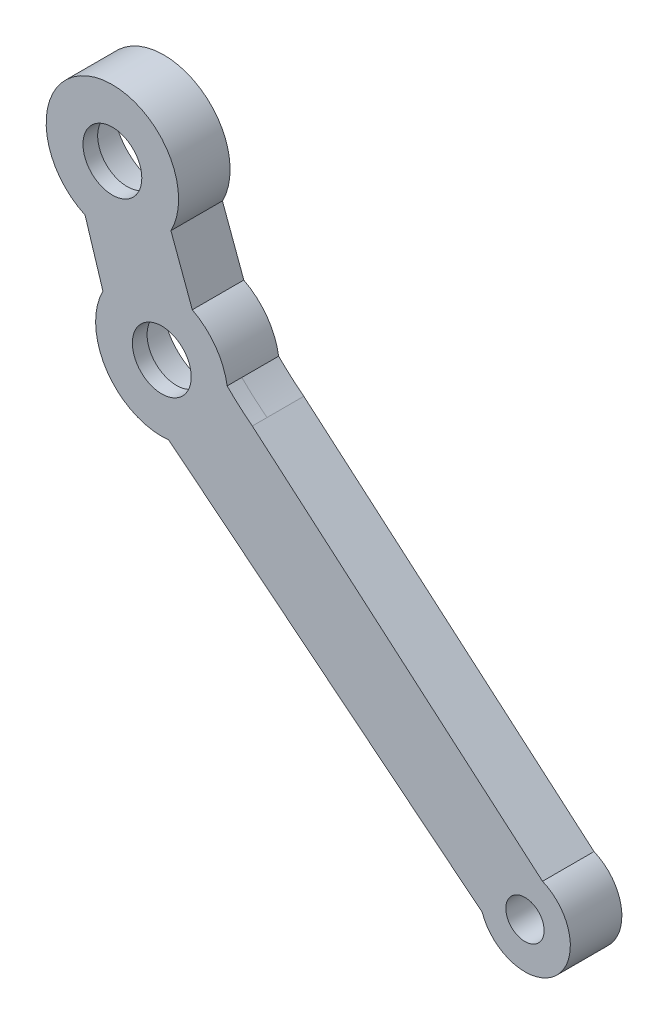
ISO-10303-21;
HEADER;
FILE_DESCRIPTION(('STEP AP214'),'2;1');
FILE_NAME('part.step','',(''),(''),'','','');
FILE_SCHEMA(('AUTOMOTIVE_DESIGN { 1 0 10303 214 1 1 1 1 }'));
ENDSEC;
DATA;
#1=APPLICATION_CONTEXT('core data for automotive mechanical design processes');
#2=APPLICATION_PROTOCOL_DEFINITION('international standard','automotive_design',2000,#1);
#3=PRODUCT_CONTEXT('',#1,'mechanical');
#4=PRODUCT('Part','Part','',(#3));
#5=PRODUCT_RELATED_PRODUCT_CATEGORY('part','',(#4));
#6=PRODUCT_DEFINITION_FORMATION('','',#4);
#7=PRODUCT_DEFINITION_CONTEXT('part definition',#1,'design');
#8=PRODUCT_DEFINITION('design','',#6,#7);
#9=PRODUCT_DEFINITION_SHAPE('','',#8);
#10=(LENGTH_UNIT() NAMED_UNIT(*) SI_UNIT(.MILLI.,.METRE.));
#11=(NAMED_UNIT(*) PLANE_ANGLE_UNIT() SI_UNIT($,.RADIAN.));
#12=(NAMED_UNIT(*) SI_UNIT($,.STERADIAN.) SOLID_ANGLE_UNIT());
#13=UNCERTAINTY_MEASURE_WITH_UNIT(LENGTH_MEASURE(1.E-05),#10,'distance_accuracy_value','');
#14=(GEOMETRIC_REPRESENTATION_CONTEXT(3) GLOBAL_UNCERTAINTY_ASSIGNED_CONTEXT((#13)) GLOBAL_UNIT_ASSIGNED_CONTEXT((#10,
#11,#12)) REPRESENTATION_CONTEXT('',''));
#15=CARTESIAN_POINT('',(0.,0.,0.));
#16=DIRECTION('',(0.,0.,1.));
#17=DIRECTION('',(1.,0.,0.));
#18=AXIS2_PLACEMENT_3D('',#15,#16,#17);
#19=CARTESIAN_POINT('',(-57.5428106413349,-67.0233845086147,5.));
#20=DIRECTION('',(-0.651405865815987,-0.758729462971173,0.));
#21=DIRECTION('',(0.758729462971173,-0.651405865815987,0.));
#22=AXIS2_PLACEMENT_3D('',#19,#20,#21);
#23=PLANE('',#22);
#24=DIRECTION('',(-0.758729462971173,0.651405865815987,0.));
#25=VECTOR('',#24,1.);
#26=CARTESIAN_POINT('',(-57.5428106413349,-67.0233845086147,0.));
#27=LINE('',#26,#25);
#28=CARTESIAN_POINT('',(-119.047770684669,-14.2184076304096,0.));
#29=VERTEX_POINT('',#28);
#30=CARTESIAN_POINT('',(-158.491736923605,19.6461412411646,0.));
#31=VERTEX_POINT('',#30);
#32=EDGE_CURVE('E115',#29,#31,#27,.T.);
#33=ORIENTED_EDGE('',*,*,#32,.T.);
#34=DIRECTION('',(0.,0.,-1.));
#35=VECTOR('',#34,1.);
#36=CARTESIAN_POINT('',(-158.491736923605,19.6461412411646,5.));
#37=LINE('',#36,#35);
#38=CARTESIAN_POINT('',(-158.491736923605,19.6461412411646,5.));
#39=VERTEX_POINT('',#38);
#40=EDGE_CURVE('E11',#39,#31,#37,.T.);
#41=ORIENTED_EDGE('',*,*,#40,.F.);
#42=DIRECTION('',(0.,0.,-1.));
#43=VECTOR('',#42,1.);
#44=CARTESIAN_POINT('',(-158.491736923605,19.6461412411646,7.));
#45=LINE('',#44,#43);
#46=CARTESIAN_POINT('',(-158.491736923605,19.6461412411646,7.));
#47=VERTEX_POINT('',#46);
#48=EDGE_CURVE('E228',#47,#39,#45,.T.);
#49=ORIENTED_EDGE('',*,*,#48,.F.);
#50=DIRECTION('',(-0.758729462971173,0.651405865815987,0.));
#51=VECTOR('',#50,1.);
#52=CARTESIAN_POINT('',(-119.047770684669,-14.2184076304096,7.));
#53=LINE('',#52,#51);
#54=CARTESIAN_POINT('',(-119.047770684669,-14.2184076304096,7.));
#55=VERTEX_POINT('',#54);
#56=EDGE_CURVE('E118',#55,#47,#53,.T.);
#57=ORIENTED_EDGE('',*,*,#56,.F.);
#58=DIRECTION('',(0.,0.,-1.));
#59=VECTOR('',#58,1.);
#60=CARTESIAN_POINT('',(-119.047770684669,-14.2184076304096,5.));
#61=LINE('',#60,#59);
#62=EDGE_CURVE('E104',#55,#29,#61,.T.);
#63=ORIENTED_EDGE('',*,*,#62,.T.);
#64=EDGE_LOOP('',(#33,#41,#49,#57,#63));
#65=FACE_BOUND('',#64,.T.);
#66=ADVANCED_FACE('F45',(#65),#23,.F.);
#67=CARTESIAN_POINT('',(750386.007974105,660889.732028088,5.));
#68=CARTESIAN_POINT('',(-745228.713855073,-666967.260908976,5.));
#69=CARTESIAN_POINT('',(739418.932730248,673140.55390769,5.));
#70=B_SPLINE_CURVE_WITH_KNOTS('',2,(#67,#68,#69),.UNSPECIFIED.,.F.,.F.,(3,3),(0.,1.),.UNSPECIFIED.);
#71=DIRECTION('',(0.,0.,-1.));
#72=VECTOR('',#71,1.);
#73=SURFACE_OF_LINEAR_EXTRUSION('',#70,#72);
#74=CARTESIAN_POINT('',(750386.007974105,660889.732028088,0.));
#75=CARTESIAN_POINT('',(-745228.713855073,-666967.260908976,0.));
#76=CARTESIAN_POINT('',(739418.932730248,673140.55390769,0.));
#77=B_SPLINE_CURVE_WITH_KNOTS('',2,(#74,#75,#76),.UNSPECIFIED.,.F.,.F.,(3,3),(0.,1.),.UNSPECIFIED.);
#78=CARTESIAN_POINT('',(-161.909962093722,22.6565194071281,0.));
#79=VERTEX_POINT('',#78);
#80=EDGE_CURVE('E124',#31,#79,#77,.T.);
#81=ORIENTED_EDGE('',*,*,#80,.T.);
#82=DIRECTION('',(0.,0.,-1.));
#83=VECTOR('',#82,1.);
#84=CARTESIAN_POINT('',(-161.909962093722,22.6565194071281,5.));
#85=LINE('',#84,#83);
#86=CARTESIAN_POINT('',(-161.909962093722,22.6565194071281,5.));
#87=VERTEX_POINT('',#86);
#88=EDGE_CURVE('E55',#87,#79,#85,.T.);
#89=ORIENTED_EDGE('',*,*,#88,.F.);
#90=EDGE_CURVE('E110',#39,#87,#70,.T.);
#91=ORIENTED_EDGE('',*,*,#90,.F.);
#92=ORIENTED_EDGE('',*,*,#40,.T.);
#93=EDGE_LOOP('',(#81,#89,#91,#92));
#94=FACE_BOUND('',#93,.T.);
#95=ADVANCED_FACE('F250',(#94),#73,.F.);
#96=CARTESIAN_POINT('',(-170.794274728342,21.2709257140738,5.));
#97=DIRECTION('',(0.,0.,-1.));
#98=DIRECTION('',(-1.,0.,0.));
#99=AXIS2_PLACEMENT_3D('',#96,#97,#98);
#100=CYLINDRICAL_SURFACE('',#99,8.99171178763538);
#101=CARTESIAN_POINT('',(-170.794274728342,21.2709257140738,0.));
#102=DIRECTION('',(0.,0.,1.));
#103=DIRECTION('',(1.,0.,0.));
#104=AXIS2_PLACEMENT_3D('',#101,#102,#103);
#105=CIRCLE('',#104,8.99171178763538);
#106=CARTESIAN_POINT('',(-166.645452489756,29.2482783391312,0.));
#107=VERTEX_POINT('',#106);
#108=EDGE_CURVE('E130',#79,#107,#105,.T.);
#109=ORIENTED_EDGE('',*,*,#108,.T.);
#110=DIRECTION('',(0.,0.,-1.));
#111=VECTOR('',#110,1.);
#112=CARTESIAN_POINT('',(-166.645452489756,29.2482783391312,5.));
#113=LINE('',#112,#111);
#114=CARTESIAN_POINT('',(-166.64545248291,29.2482783522951,7.));
#115=VERTEX_POINT('',#114);
#116=EDGE_CURVE('E175',#115,#107,#113,.T.);
#117=ORIENTED_EDGE('',*,*,#116,.F.);
#118=CARTESIAN_POINT('',(-170.794274728342,21.2709257140738,7.));
#119=DIRECTION('',(0.,0.,1.));
#120=DIRECTION('',(1.,0.,0.));
#121=AXIS2_PLACEMENT_3D('',#118,#119,#120);
#122=CIRCLE('',#121,8.99171180247304);
#123=CARTESIAN_POINT('',(-161.909962022454,22.6565193353554,7.));
#124=VERTEX_POINT('',#123);
#125=EDGE_CURVE('E215',#124,#115,#122,.T.);
#126=ORIENTED_EDGE('',*,*,#125,.F.);
#127=DIRECTION('',(0.,0.,-1.));
#128=VECTOR('',#127,1.);
#129=CARTESIAN_POINT('',(-161.909962022454,22.6565193353554,7.));
#130=LINE('',#129,#128);
#131=EDGE_CURVE('E185',#124,#87,#130,.T.);
#132=ORIENTED_EDGE('',*,*,#131,.T.);
#133=ORIENTED_EDGE('',*,*,#88,.T.);
#134=EDGE_LOOP('',(#109,#117,#126,#132,#133));
#135=FACE_BOUND('',#134,.T.);
#136=ADVANCED_FACE('F181',(#135),#100,.T.);
#137=CARTESIAN_POINT('',(-137.117582379586,-50.6648768191572,5.));
#138=DIRECTION('',(-0.938014544046687,-0.346595896047381,0.));
#139=DIRECTION('',(0.346595896047381,-0.938014544046687,0.));
#140=AXIS2_PLACEMENT_3D('',#137,#138,#139);
#141=PLANE('',#140);
#142=DIRECTION('',(-0.346595896047381,0.938014544046687,0.));
#143=VECTOR('',#142,1.);
#144=CARTESIAN_POINT('',(-137.117582379586,-50.6648768191572,0.));
#145=LINE('',#144,#143);
#146=CARTESIAN_POINT('',(-169.551288031007,37.112526102551,0.));
#147=VERTEX_POINT('',#146);
#148=EDGE_CURVE('E144',#107,#147,#145,.T.);
#149=ORIENTED_EDGE('',*,*,#148,.T.);
#150=DIRECTION('',(0.,0.,-1.));
#151=VECTOR('',#150,1.);
#152=CARTESIAN_POINT('',(-169.551288031007,37.112526102551,5.));
#153=LINE('',#152,#151);
#154=CARTESIAN_POINT('',(-169.551288031007,37.112526102551,7.));
#155=VERTEX_POINT('',#154);
#156=EDGE_CURVE('E171',#155,#147,#153,.T.);
#157=ORIENTED_EDGE('',*,*,#156,.F.);
#158=DIRECTION('',(-0.346595896047381,0.938014544046686,0.));
#159=VECTOR('',#158,1.);
#160=CARTESIAN_POINT('',(-166.645452489756,29.2482783391312,7.));
#161=LINE('',#160,#159);
#162=EDGE_CURVE('E209',#115,#155,#161,.T.);
#163=ORIENTED_EDGE('',*,*,#162,.F.);
#164=ORIENTED_EDGE('',*,*,#116,.T.);
#165=EDGE_LOOP('',(#149,#157,#163,#164));
#166=FACE_BOUND('',#165,.T.);
#167=ADVANCED_FACE('F191',(#166),#141,.F.);
#168=CARTESIAN_POINT('',(-177.50849540305,41.3176242985861,5.));
#169=DIRECTION('',(0.,0.,-1.));
#170=DIRECTION('',(-1.,0.,0.));
#171=AXIS2_PLACEMENT_3D('',#168,#169,#170);
#172=CYLINDRICAL_SURFACE('',#171,9.);
#173=CARTESIAN_POINT('',(-177.50849540305,41.3176242985861,0.));
#174=DIRECTION('',(0.,0.,1.));
#175=DIRECTION('',(1.,0.,0.));
#176=AXIS2_PLACEMENT_3D('',#173,#174,#175);
#177=CIRCLE('',#176,9.);
#178=CARTESIAN_POINT('',(-181.222431589448,33.1196563794388,0.));
#179=VERTEX_POINT('',#178);
#180=EDGE_CURVE('E147',#147,#179,#177,.T.);
#181=ORIENTED_EDGE('',*,*,#180,.T.);
#182=DIRECTION('',(0.,0.,-1.));
#183=VECTOR('',#182,1.);
#184=CARTESIAN_POINT('',(-181.222431589448,33.1196563794388,5.));
#185=LINE('',#184,#183);
#186=CARTESIAN_POINT('',(-181.222431589448,33.1196563794388,7.));
#187=VERTEX_POINT('',#186);
#188=EDGE_CURVE('E167',#187,#179,#185,.T.);
#189=ORIENTED_EDGE('',*,*,#188,.F.);
#190=CARTESIAN_POINT('',(-177.50849540305,41.3176242985861,7.));
#191=DIRECTION('',(0.,0.,1.));
#192=DIRECTION('',(1.,0.,0.));
#193=AXIS2_PLACEMENT_3D('',#190,#191,#192);
#194=CIRCLE('',#193,9.00000000000001);
#195=EDGE_CURVE('E200',#155,#187,#194,.T.);
#196=ORIENTED_EDGE('',*,*,#195,.F.);
#197=ORIENTED_EDGE('',*,*,#156,.T.);
#198=EDGE_LOOP('',(#181,#189,#196,#197));
#199=FACE_BOUND('',#198,.T.);
#200=ADVANCED_FACE('F197',(#199),#172,.T.);
#201=CARTESIAN_POINT('',(-155.544938051549,-48.7718796659953,5.));
#202=DIRECTION('',(0.954192963420192,0.2991918925362,0.));
#203=DIRECTION('',(-0.2991918925362,0.954192963420192,0.));
#204=AXIS2_PLACEMENT_3D('',#201,#202,#203);
#205=PLANE('',#204);
#206=DIRECTION('',(0.2991918925362,-0.954192963420192,0.));
#207=VECTOR('',#206,1.);
#208=CARTESIAN_POINT('',(-155.544938051549,-48.7718796659953,0.));
#209=LINE('',#208,#207);
#210=CARTESIAN_POINT('',(-178.794316038629,25.3758276502487,0.));
#211=VERTEX_POINT('',#210);
#212=EDGE_CURVE('E150',#179,#211,#209,.T.);
#213=ORIENTED_EDGE('',*,*,#212,.T.);
#214=DIRECTION('',(0.,0.,-1.));
#215=VECTOR('',#214,1.);
#216=CARTESIAN_POINT('',(-178.794316038629,25.3758276502487,5.));
#217=LINE('',#216,#215);
#218=CARTESIAN_POINT('',(-178.794316038629,25.3758276502487,7.));
#219=VERTEX_POINT('',#218);
#220=EDGE_CURVE('E163',#219,#211,#217,.T.);
#221=ORIENTED_EDGE('',*,*,#220,.F.);
#222=DIRECTION('',(0.2991918925362,-0.954192963420192,0.));
#223=VECTOR('',#222,1.);
#224=CARTESIAN_POINT('',(-181.222431589448,33.1196563794388,7.));
#225=LINE('',#224,#223);
#226=EDGE_CURVE('E208',#187,#219,#225,.T.);
#227=ORIENTED_EDGE('',*,*,#226,.F.);
#228=ORIENTED_EDGE('',*,*,#188,.T.);
#229=EDGE_LOOP('',(#213,#221,#227,#228));
#230=FACE_BOUND('',#229,.T.);
#231=ADVANCED_FACE('F339',(#230),#205,.F.);
#232=CARTESIAN_POINT('',(-170.794274728342,21.2709257140738,5.));
#233=DIRECTION('',(0.,0.,-1.));
#234=DIRECTION('',(-1.,0.,0.));
#235=AXIS2_PLACEMENT_3D('',#232,#233,#234);
#236=CYLINDRICAL_SURFACE('',#235,8.99171178763538);
#237=CARTESIAN_POINT('',(-170.794274728342,21.2709257140738,0.));
#238=DIRECTION('',(0.,0.,1.));
#239=DIRECTION('',(1.,0.,0.));
#240=AXIS2_PLACEMENT_3D('',#237,#238,#239);
#241=CIRCLE('',#240,8.99171178763538);
#242=CARTESIAN_POINT('',(-169.857983807643,12.3280939375212,0.));
#243=VERTEX_POINT('',#242);
#244=EDGE_CURVE('E153',#211,#243,#241,.T.);
#245=ORIENTED_EDGE('',*,*,#244,.T.);
#246=DIRECTION('',(0.,0.,-1.));
#247=VECTOR('',#246,1.);
#248=CARTESIAN_POINT('',(-169.857983807643,12.3280939375212,5.));
#249=LINE('',#248,#247);
#250=CARTESIAN_POINT('',(-169.857983807643,12.3280939375212,7.));
#251=VERTEX_POINT('',#250);
#252=EDGE_CURVE('E160',#251,#243,#249,.T.);
#253=ORIENTED_EDGE('',*,*,#252,.F.);
#254=CARTESIAN_POINT('',(-170.794274728342,21.2709257140738,7.));
#255=DIRECTION('',(0.,0.,1.));
#256=DIRECTION('',(1.,0.,0.));
#257=AXIS2_PLACEMENT_3D('',#254,#255,#256);
#258=CIRCLE('',#257,8.99171178763539);
#259=EDGE_CURVE('E213',#219,#251,#258,.T.);
#260=ORIENTED_EDGE('',*,*,#259,.F.);
#261=ORIENTED_EDGE('',*,*,#220,.T.);
#262=EDGE_LOOP('',(#245,#253,#260,#261));
#263=FACE_BOUND('',#262,.T.);
#264=ADVANCED_FACE('F336',(#263),#236,.T.);
#265=CARTESIAN_POINT('',(-60.6968096456186,-75.4676287695073,5.));
#266=DIRECTION('',(0.626724705023871,0.77924074849352,0.));
#267=DIRECTION('',(-0.77924074849352,0.626724705023871,0.));
#268=AXIS2_PLACEMENT_3D('',#265,#266,#267);
#269=PLANE('',#268);
#270=DIRECTION('',(0.77924074849352,-0.626724705023871,0.));
#271=VECTOR('',#270,1.);
#272=CARTESIAN_POINT('',(-60.6968096456186,-75.4676287695073,0.));
#273=LINE('',#272,#271);
#274=CARTESIAN_POINT('',(-127.253789063666,-21.9374413740227,0.));
#275=VERTEX_POINT('',#274);
#276=EDGE_CURVE('E93',#243,#275,#273,.T.);
#277=ORIENTED_EDGE('',*,*,#276,.T.);
#278=DIRECTION('',(0.,0.,-1.));
#279=VECTOR('',#278,1.);
#280=CARTESIAN_POINT('',(-127.253789063666,-21.9374413740227,5.));
#281=LINE('',#280,#279);
#282=CARTESIAN_POINT('',(-127.253789063666,-21.9374413740227,7.));
#283=VERTEX_POINT('',#282);
#284=EDGE_CURVE('E106',#283,#275,#281,.T.);
#285=ORIENTED_EDGE('',*,*,#284,.F.);
#286=DIRECTION('',(0.77924074849352,-0.626724705023871,0.));
#287=VECTOR('',#286,1.);
#288=CARTESIAN_POINT('',(-169.857983807643,12.3280939375212,7.));
#289=LINE('',#288,#287);
#290=EDGE_CURVE('E222',#251,#283,#289,.T.);
#291=ORIENTED_EDGE('',*,*,#290,.F.);
#292=ORIENTED_EDGE('',*,*,#252,.T.);
#293=EDGE_LOOP('',(#277,#285,#291,#292));
#294=FACE_BOUND('',#293,.T.);
#295=ADVANCED_FACE('F260',(#294),#269,.F.);
#296=CARTESIAN_POINT('',(-121.432089480919,-19.9050450231592,5.));
#297=DIRECTION('',(0.,0.,-1.));
#298=DIRECTION('',(-1.,0.,0.));
#299=AXIS2_PLACEMENT_3D('',#296,#297,#298);
#300=CYLINDRICAL_SURFACE('',#299,2.6);
#301=CARTESIAN_POINT('',(-121.432089480919,-19.9050450231592,0.));
#302=DIRECTION('',(0.,0.,1.));
#303=DIRECTION('',(1.,0.,0.));
#304=AXIS2_PLACEMENT_3D('',#301,#302,#303);
#305=CIRCLE('',#304,2.6);
#306=CARTESIAN_POINT('',(-118.832089480919,-19.9050450231592,0.));
#307=VERTEX_POINT('',#306);
#308=EDGE_CURVE('E126',#307,#307,#305,.T.);
#309=ORIENTED_EDGE('',*,*,#308,.F.);
#310=EDGE_LOOP('',(#309));
#311=FACE_BOUND('',#310,.T.);
#312=CARTESIAN_POINT('',(-121.432089480919,-19.9050450231592,7.));
#313=DIRECTION('',(0.,0.,1.));
#314=DIRECTION('',(1.,0.,0.));
#315=AXIS2_PLACEMENT_3D('',#312,#313,#314);
#316=CIRCLE('',#315,2.59999999998777);
#317=CARTESIAN_POINT('',(-118.832089480931,-19.9050450231592,7.));
#318=VERTEX_POINT('',#317);
#319=EDGE_CURVE('E288',#318,#318,#316,.T.);
#320=ORIENTED_EDGE('',*,*,#319,.T.);
#321=EDGE_LOOP('',(#320));
#322=FACE_BOUND('',#321,.T.);
#323=ADVANCED_FACE('F257',(#311,#322),#300,.F.);
#324=CARTESIAN_POINT('',(-177.50849540305,41.3176242985861,5.));
#325=DIRECTION('',(0.,0.,-1.));
#326=DIRECTION('',(-1.,0.,0.));
#327=AXIS2_PLACEMENT_3D('',#324,#325,#326);
#328=CYLINDRICAL_SURFACE('',#327,6.89999999999999);
#329=CARTESIAN_POINT('',(-177.50849540305,41.3176242985861,5.));
#330=DIRECTION('',(0.,0.,1.));
#331=DIRECTION('',(1.,0.,0.));
#332=AXIS2_PLACEMENT_3D('',#329,#330,#331);
#333=CIRCLE('',#332,6.89999999999999);
#334=CARTESIAN_POINT('',(-170.60849540305,41.3176242985861,5.));
#335=VERTEX_POINT('',#334);
#336=EDGE_CURVE('E232',#335,#335,#333,.T.);
#337=ORIENTED_EDGE('',*,*,#336,.T.);
#338=EDGE_LOOP('',(#337));
#339=FACE_BOUND('',#338,.T.);
#340=CARTESIAN_POINT('',(-177.50849540305,41.3176242985861,0.));
#341=DIRECTION('',(0.,0.,1.));
#342=DIRECTION('',(1.,0.,0.));
#343=AXIS2_PLACEMENT_3D('',#340,#341,#342);
#344=CIRCLE('',#343,6.89999999999999);
#345=CARTESIAN_POINT('',(-170.60849540305,41.3176242985861,0.));
#346=VERTEX_POINT('',#345);
#347=EDGE_CURVE('E133',#346,#346,#344,.T.);
#348=ORIENTED_EDGE('',*,*,#347,.F.);
#349=EDGE_LOOP('',(#348));
#350=FACE_BOUND('',#349,.T.);
#351=ADVANCED_FACE('F259',(#339,#350),#328,.F.);
#352=CARTESIAN_POINT('',(-170.794274728342,21.2709257140738,5.));
#353=DIRECTION('',(0.,0.,-1.));
#354=DIRECTION('',(-1.,0.,0.));
#355=AXIS2_PLACEMENT_3D('',#352,#353,#354);
#356=CYLINDRICAL_SURFACE('',#355,6.90151996859568);
#357=CARTESIAN_POINT('',(-170.794274728342,21.2709257140738,5.));
#358=DIRECTION('',(0.,0.,1.));
#359=DIRECTION('',(1.,0.,0.));
#360=AXIS2_PLACEMENT_3D('',#357,#358,#359);
#361=CIRCLE('',#360,6.90151996859568);
#362=CARTESIAN_POINT('',(-163.892754759747,21.2709257140738,5.));
#363=VERTEX_POINT('',#362);
#364=EDGE_CURVE('E233',#363,#363,#361,.T.);
#365=ORIENTED_EDGE('',*,*,#364,.T.);
#366=EDGE_LOOP('',(#365));
#367=FACE_BOUND('',#366,.T.);
#368=CARTESIAN_POINT('',(-170.794274728342,21.2709257140738,0.));
#369=DIRECTION('',(0.,0.,1.));
#370=DIRECTION('',(1.,0.,0.));
#371=AXIS2_PLACEMENT_3D('',#368,#369,#370);
#372=CIRCLE('',#371,6.90151996859568);
#373=CARTESIAN_POINT('',(-163.892754759747,21.2709257140738,0.));
#374=VERTEX_POINT('',#373);
#375=EDGE_CURVE('E237',#374,#374,#372,.T.);
#376=ORIENTED_EDGE('',*,*,#375,.F.);
#377=EDGE_LOOP('',(#376));
#378=FACE_BOUND('',#377,.T.);
#379=ADVANCED_FACE('F47',(#367,#378),#356,.F.);
#380=CARTESIAN_POINT('',(-121.432089480919,-19.9050450231592,5.));
#381=DIRECTION('',(0.,0.,-1.));
#382=DIRECTION('',(-1.,0.,0.));
#383=AXIS2_PLACEMENT_3D('',#380,#381,#382);
#384=CYLINDRICAL_SURFACE('',#383,6.16626474932495);
#385=CARTESIAN_POINT('',(-121.432089480919,-19.9050450231592,0.));
#386=DIRECTION('',(0.,0.,1.));
#387=DIRECTION('',(1.,0.,0.));
#388=AXIS2_PLACEMENT_3D('',#385,#386,#387);
#389=CIRCLE('',#388,6.16626474932495);
#390=EDGE_CURVE('E99',#275,#29,#389,.T.);
#391=ORIENTED_EDGE('',*,*,#390,.T.);
#392=ORIENTED_EDGE('',*,*,#62,.F.);
#393=CARTESIAN_POINT('',(-121.432089480919,-19.9050450231592,7.));
#394=DIRECTION('',(0.,0.,1.));
#395=DIRECTION('',(1.,0.,0.));
#396=AXIS2_PLACEMENT_3D('',#393,#394,#395);
#397=CIRCLE('',#396,6.16626474932494);
#398=EDGE_CURVE('E306',#283,#55,#397,.T.);
#399=ORIENTED_EDGE('',*,*,#398,.F.);
#400=ORIENTED_EDGE('',*,*,#284,.T.);
#401=EDGE_LOOP('',(#391,#392,#399,#400));
#402=FACE_BOUND('',#401,.T.);
#403=ADVANCED_FACE('F101',(#402),#384,.T.);
#404=CARTESIAN_POINT('',(0.,0.,0.));
#405=DIRECTION('',(0.,0.,1.));
#406=DIRECTION('',(1.,0.,0.));
#407=AXIS2_PLACEMENT_3D('',#404,#405,#406);
#408=PLANE('',#407);
#409=ORIENTED_EDGE('',*,*,#375,.T.);
#410=EDGE_LOOP('',(#409));
#411=FACE_BOUND('',#410,.T.);
#412=ORIENTED_EDGE('',*,*,#347,.T.);
#413=EDGE_LOOP('',(#412));
#414=FACE_BOUND('',#413,.T.);
#415=ORIENTED_EDGE('',*,*,#308,.T.);
#416=EDGE_LOOP('',(#415));
#417=FACE_BOUND('',#416,.T.);
#418=ORIENTED_EDGE('',*,*,#32,.F.);
#419=ORIENTED_EDGE('',*,*,#390,.F.);
#420=ORIENTED_EDGE('',*,*,#276,.F.);
#421=ORIENTED_EDGE('',*,*,#244,.F.);
#422=ORIENTED_EDGE('',*,*,#212,.F.);
#423=ORIENTED_EDGE('',*,*,#180,.F.);
#424=ORIENTED_EDGE('',*,*,#148,.F.);
#425=ORIENTED_EDGE('',*,*,#108,.F.);
#426=ORIENTED_EDGE('',*,*,#80,.F.);
#427=EDGE_LOOP('',(#418,#419,#420,#421,#422,#423,#424,#425,#426));
#428=FACE_BOUND('',#427,.T.);
#429=ADVANCED_FACE('F122',(#411,#414,#417,#428),#408,.F.);
#430=CARTESIAN_POINT('',(-121.432089480919,-19.9050450231592,5.));
#431=DIRECTION('',(0.,0.,1.));
#432=DIRECTION('',(1.,0.,0.));
#433=AXIS2_PLACEMENT_3D('',#430,#431,#432);
#434=PLANE('',#433);
#435=CARTESIAN_POINT('',(-170.794274728342,21.2709257140738,5.));
#436=DIRECTION('',(0.,0.,1.));
#437=DIRECTION('',(1.,0.,0.));
#438=AXIS2_PLACEMENT_3D('',#435,#436,#437);
#439=CIRCLE('',#438,3.99999999999999);
#440=CARTESIAN_POINT('',(-166.794274728342,21.2709257140738,5.));
#441=VERTEX_POINT('',#440);
#442=EDGE_CURVE('E291',#441,#441,#439,.T.);
#443=ORIENTED_EDGE('',*,*,#442,.T.);
#444=EDGE_LOOP('',(#443));
#445=FACE_BOUND('',#444,.T.);
#446=ORIENTED_EDGE('',*,*,#364,.F.);
#447=EDGE_LOOP('',(#446));
#448=FACE_BOUND('',#447,.T.);
#449=ADVANCED_FACE('F281',(#445,#448),#434,.F.);
#450=CARTESIAN_POINT('',(-177.50849540305,41.3176242985861,5.));
#451=DIRECTION('',(0.,0.,1.));
#452=DIRECTION('',(1.,0.,0.));
#453=AXIS2_PLACEMENT_3D('',#450,#451,#452);
#454=CIRCLE('',#453,3.99999999999999);
#455=CARTESIAN_POINT('',(-173.50849540305,41.3176242985861,5.));
#456=VERTEX_POINT('',#455);
#457=EDGE_CURVE('E300',#456,#456,#454,.T.);
#458=ORIENTED_EDGE('',*,*,#457,.T.);
#459=EDGE_LOOP('',(#458));
#460=FACE_BOUND('',#459,.T.);
#461=ORIENTED_EDGE('',*,*,#336,.F.);
#462=EDGE_LOOP('',(#461));
#463=FACE_BOUND('',#462,.T.);
#464=ADVANCED_FACE('F468',(#460,#463),#434,.F.);
#465=CARTESIAN_POINT('',(-121.432089480919,-19.9050450231592,7.));
#466=DIRECTION('',(0.,0.,1.));
#467=DIRECTION('',(1.,0.,0.));
#468=AXIS2_PLACEMENT_3D('',#465,#466,#467);
#469=PLANE('',#468);
#470=CARTESIAN_POINT('',(-170.794274728342,21.2709257140738,7.));
#471=DIRECTION('',(0.,0.,1.));
#472=DIRECTION('',(1.,0.,0.));
#473=AXIS2_PLACEMENT_3D('',#470,#471,#472);
#474=CIRCLE('',#473,3.99999999999999);
#475=CARTESIAN_POINT('',(-166.794274728342,21.2709257140738,7.));
#476=VERTEX_POINT('',#475);
#477=EDGE_CURVE('E295',#476,#476,#474,.T.);
#478=ORIENTED_EDGE('',*,*,#477,.F.);
#479=EDGE_LOOP('',(#478));
#480=FACE_BOUND('',#479,.T.);
#481=ORIENTED_EDGE('',*,*,#398,.T.);
#482=ORIENTED_EDGE('',*,*,#56,.T.);
#483=CARTESIAN_POINT('',(750386.007974146,660889.732028041,7.));
#484=CARTESIAN_POINT('',(-745228.713855108,-666967.260908937,7.));
#485=CARTESIAN_POINT('',(739418.932730277,673140.553907658,7.));
#486=B_SPLINE_CURVE_WITH_KNOTS('',2,(#483,#484,#485),.UNSPECIFIED.,.F.,.F.,(3,3),(0.,1.),.UNSPECIFIED.);
#487=EDGE_CURVE('E314',#47,#124,#486,.T.);
#488=ORIENTED_EDGE('',*,*,#487,.T.);
#489=ORIENTED_EDGE('',*,*,#125,.T.);
#490=ORIENTED_EDGE('',*,*,#162,.T.);
#491=ORIENTED_EDGE('',*,*,#195,.T.);
#492=ORIENTED_EDGE('',*,*,#226,.T.);
#493=ORIENTED_EDGE('',*,*,#259,.T.);
#494=ORIENTED_EDGE('',*,*,#290,.T.);
#495=EDGE_LOOP('',(#481,#482,#488,#489,#490,#491,#492,#493,#494));
#496=FACE_BOUND('',#495,.T.);
#497=CARTESIAN_POINT('',(-177.50849540305,41.3176242985861,7.));
#498=DIRECTION('',(0.,0.,1.));
#499=DIRECTION('',(1.,0.,0.));
#500=AXIS2_PLACEMENT_3D('',#497,#498,#499);
#501=CIRCLE('',#500,3.99999999999999);
#502=CARTESIAN_POINT('',(-173.50849540305,41.3176242985861,7.));
#503=VERTEX_POINT('',#502);
#504=EDGE_CURVE('E302',#503,#503,#501,.T.);
#505=ORIENTED_EDGE('',*,*,#504,.F.);
#506=EDGE_LOOP('',(#505));
#507=FACE_BOUND('',#506,.T.);
#508=ORIENTED_EDGE('',*,*,#319,.F.);
#509=EDGE_LOOP('',(#508));
#510=FACE_BOUND('',#509,.T.);
#511=ADVANCED_FACE('F328',(#480,#496,#507,#510),#469,.T.);
#512=DIRECTION('',(0.,0.,-1.));
#513=VECTOR('',#512,1.);
#514=SURFACE_OF_LINEAR_EXTRUSION('',#486,#513);
#515=ORIENTED_EDGE('',*,*,#90,.T.);
#516=ORIENTED_EDGE('',*,*,#131,.F.);
#517=ORIENTED_EDGE('',*,*,#487,.F.);
#518=ORIENTED_EDGE('',*,*,#48,.T.);
#519=EDGE_LOOP('',(#515,#516,#517,#518));
#520=FACE_BOUND('',#519,.T.);
#521=ADVANCED_FACE('F324',(#520),#514,.F.);
#522=CARTESIAN_POINT('',(-177.50849540305,41.3176242985861,7.));
#523=DIRECTION('',(0.,0.,-1.));
#524=DIRECTION('',(-1.,0.,0.));
#525=AXIS2_PLACEMENT_3D('',#522,#523,#524);
#526=CYLINDRICAL_SURFACE('',#525,3.99999999999999);
#527=ORIENTED_EDGE('',*,*,#504,.T.);
#528=EDGE_LOOP('',(#527));
#529=FACE_BOUND('',#528,.T.);
#530=ORIENTED_EDGE('',*,*,#457,.F.);
#531=EDGE_LOOP('',(#530));
#532=FACE_BOUND('',#531,.T.);
#533=ADVANCED_FACE('F327',(#529,#532),#526,.F.);
#534=CARTESIAN_POINT('',(-170.794274728342,21.2709257140738,7.));
#535=DIRECTION('',(0.,0.,-1.));
#536=DIRECTION('',(-1.,0.,0.));
#537=AXIS2_PLACEMENT_3D('',#534,#535,#536);
#538=CYLINDRICAL_SURFACE('',#537,3.99999999999999);
#539=ORIENTED_EDGE('',*,*,#477,.T.);
#540=EDGE_LOOP('',(#539));
#541=FACE_BOUND('',#540,.T.);
#542=ORIENTED_EDGE('',*,*,#442,.F.);
#543=EDGE_LOOP('',(#542));
#544=FACE_BOUND('',#543,.T.);
#545=ADVANCED_FACE('F503',(#541,#544),#538,.F.);
#546=CLOSED_SHELL('',(#66,#95,#136,#167,#200,#231,#264,#295,#323,#351,#379,#403,#429,#449,#464,
#511,#521,#533,#545));
#547=MANIFOLD_SOLID_BREP('B2',#546);
#548=ADVANCED_BREP_SHAPE_REPRESENTATION('',(#18,#547),#14);
#549=SHAPE_DEFINITION_REPRESENTATION(#9,#548);
ENDSEC;
END-ISO-10303-21;
